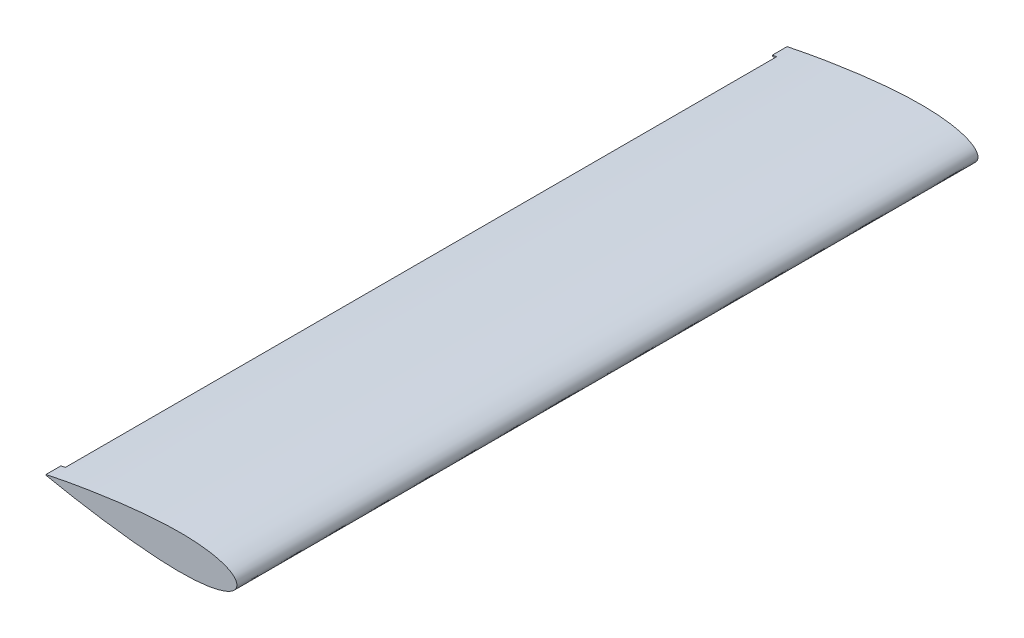
ISO-10303-21;
HEADER;
FILE_DESCRIPTION(('STEP AP214'),'2;1');
FILE_NAME('part.step','',(''),(''),'','','');
FILE_SCHEMA(('AUTOMOTIVE_DESIGN { 1 0 10303 214 1 1 1 1 }'));
ENDSEC;
DATA;
#1=APPLICATION_CONTEXT('core data for automotive mechanical design processes');
#2=APPLICATION_PROTOCOL_DEFINITION('international standard','automotive_design',2000,#1);
#3=PRODUCT_CONTEXT('',#1,'mechanical');
#4=PRODUCT('Part','Part','',(#3));
#5=PRODUCT_RELATED_PRODUCT_CATEGORY('part','',(#4));
#6=PRODUCT_DEFINITION_FORMATION('','',#4);
#7=PRODUCT_DEFINITION_CONTEXT('part definition',#1,'design');
#8=PRODUCT_DEFINITION('design','',#6,#7);
#9=PRODUCT_DEFINITION_SHAPE('','',#8);
#10=(LENGTH_UNIT() NAMED_UNIT(*) SI_UNIT(.MILLI.,.METRE.));
#11=(NAMED_UNIT(*) PLANE_ANGLE_UNIT() SI_UNIT($,.RADIAN.));
#12=(NAMED_UNIT(*) SI_UNIT($,.STERADIAN.) SOLID_ANGLE_UNIT());
#13=UNCERTAINTY_MEASURE_WITH_UNIT(LENGTH_MEASURE(1.E-05),#10,'distance_accuracy_value','');
#14=(GEOMETRIC_REPRESENTATION_CONTEXT(3) GLOBAL_UNCERTAINTY_ASSIGNED_CONTEXT((#13)) GLOBAL_UNIT_ASSIGNED_CONTEXT((#10,
#11,#12)) REPRESENTATION_CONTEXT('',''));
#15=CARTESIAN_POINT('',(0.,0.,0.));
#16=DIRECTION('',(0.,0.,1.));
#17=DIRECTION('',(1.,0.,0.));
#18=AXIS2_PLACEMENT_3D('',#15,#16,#17);
#19=CARTESIAN_POINT('',(-128.823156865199,-0.243601684072974,250.));
#20=DIRECTION('',(1.,9.51385280802963E-12,0.));
#21=DIRECTION('',(-9.51385280802963E-12,1.,0.));
#22=AXIS2_PLACEMENT_3D('',#19,#20,#21);
#23=PLANE('',#22);
#24=DIRECTION('',(-9.51385280802963E-12,1.,0.));
#25=VECTOR('',#24,1.);
#26=CARTESIAN_POINT('',(-128.823156865199,-0.243601684072974,240.));
#27=LINE('',#26,#25);
#28=CARTESIAN_POINT('',(-128.823156865199,-0.243601684072974,240.));
#29=VERTEX_POINT('',#28);
#30=CARTESIAN_POINT('',(-128.823156865204,0.243601683620288,240.));
#31=VERTEX_POINT('',#30);
#32=EDGE_CURVE('E113',#29,#31,#27,.T.);
#33=ORIENTED_EDGE('',*,*,#32,.F.);
#34=DIRECTION('',(0.,0.,-1.));
#35=VECTOR('',#34,1.);
#36=CARTESIAN_POINT('',(-128.823156865199,-0.243601684072974,250.));
#37=LINE('',#36,#35);
#38=CARTESIAN_POINT('',(-128.823156865199,-0.243601684072974,250.));
#39=VERTEX_POINT('',#38);
#40=EDGE_CURVE('E88',#39,#29,#37,.T.);
#41=ORIENTED_EDGE('',*,*,#40,.F.);
#42=DIRECTION('',(9.51385280802963E-12,-1.,0.));
#43=VECTOR('',#42,1.);
#44=CARTESIAN_POINT('',(-128.823156865199,-0.243601684072974,250.));
#45=LINE('',#44,#43);
#46=CARTESIAN_POINT('',(-128.823156865204,0.243601683620288,250.));
#47=VERTEX_POINT('',#46);
#48=EDGE_CURVE('E63',#47,#39,#45,.T.);
#49=ORIENTED_EDGE('',*,*,#48,.F.);
#50=DIRECTION('',(0.,0.,-1.));
#51=VECTOR('',#50,1.);
#52=CARTESIAN_POINT('',(-128.823156865204,0.243601683620288,250.));
#53=LINE('',#52,#51);
#54=EDGE_CURVE('E110',#47,#31,#53,.T.);
#55=ORIENTED_EDGE('',*,*,#54,.T.);
#56=EDGE_LOOP('',(#33,#41,#49,#55));
#57=FACE_BOUND('',#56,.T.);
#58=ADVANCED_FACE('F39',(#57),#23,.F.);
#59=CARTESIAN_POINT('',(-128.823156865199,-0.243601684072974,250.));
#60=CARTESIAN_POINT('',(-126.67714933903,-0.687269090320597,250.));
#61=CARTESIAN_POINT('',(-122.389962266096,-1.57360576228101,250.));
#62=CARTESIAN_POINT('',(-113.807735112211,-3.21807022031134,250.));
#63=CARTESIAN_POINT('',(-103.07949016515,-5.10862701099124,250.));
#64=CARTESIAN_POINT('',(-90.1954893204452,-7.12124715565496,250.));
#65=CARTESIAN_POINT('',(-77.3135815758503,-8.86886751082018,250.));
#66=CARTESIAN_POINT('',(-64.431363132497,-10.2973059157991,250.));
#67=CARTESIAN_POINT('',(-51.5460997412131,-11.3098208599836,250.));
#68=CARTESIAN_POINT('',(-40.7957563190001,-11.669751168641,250.));
#69=CARTESIAN_POINT('',(-32.200591207622,-11.5262309895172,250.));
#70=CARTESIAN_POINT('',(-25.7490073823002,-11.1441462592192,250.));
#71=CARTESIAN_POINT('',(-19.2852859646194,-10.4066141370908,250.));
#72=CARTESIAN_POINT('',(-13.9055558809757,-9.37595496172941,250.));
#73=CARTESIAN_POINT('',(-9.61473988406368,-8.14999777520421,250.));
#74=CARTESIAN_POINT('',(-6.3381794270068,-6.91132829545563,250.));
#75=CARTESIAN_POINT('',(-3.59327506674445,-5.42038826422837,250.));
#76=CARTESIAN_POINT('',(-1.06899642309347,-3.35720252431963,250.));
#77=CARTESIAN_POINT('',(0.697558781943044,1.01585878065042E-09,250.));
#78=CARTESIAN_POINT('',(-1.06899642315786,3.35720252631744,250.));
#79=CARTESIAN_POINT('',(-3.59327506684841,5.42038826617776,250.));
#80=CARTESIAN_POINT('',(-6.33817942713939,6.91132829735238,250.));
#81=CARTESIAN_POINT('',(-9.61473988421998,8.14999777703808,250.));
#82=CARTESIAN_POINT('',(-13.9055558811556,9.37595496348099,250.));
#83=CARTESIAN_POINT('',(-19.285285964819,10.4066141387392,250.));
#84=CARTESIAN_POINT('',(-25.749007382514,11.1441462607436,250.));
#85=CARTESIAN_POINT('',(-32.2005912078431,11.5262309909179,250.));
#86=CARTESIAN_POINT('',(-40.795756319224,11.6697511698768,250.));
#87=CARTESIAN_POINT('',(-51.54609974143,11.3098208610131,250.));
#88=CARTESIAN_POINT('',(-64.4313631326944,10.2973059165815,250.));
#89=CARTESIAN_POINT('',(-77.3135815760204,8.86886751135552,250.));
#90=CARTESIAN_POINT('',(-90.1954893205818,7.12124715594321,250.));
#91=CARTESIAN_POINT('',(-103.079490165248,5.10862701103235,250.));
#92=CARTESIAN_POINT('',(-113.807735112272,3.21807022014666,250.));
#93=CARTESIAN_POINT('',(-122.389962266126,1.57360576195172,250.));
#94=CARTESIAN_POINT('',(-126.677149339043,0.687269089909074,250.));
#95=CARTESIAN_POINT('',(-128.823156865204,0.243601683620288,250.));
#96=B_SPLINE_CURVE_WITH_KNOTS('',3,(#59,#60,#61,#62,#63,#64,#65,#66,#67,#68,#69,#70,#71,#72,#73,
#74,#75,#76,#77,#78,#79,#80,#81,#82,#83,#84,#85,#86,#87,#88,#89,#90,#91,#92,#93,#94,#95),
.UNSPECIFIED.,.F.,.F.,(4,1,1,1,1,1,1,1,1,1,1,1,1,1,1,1,1,1,1,1,1,1,1,1,1,1,1,1,1,1,1,1,1,1,4),
(0.,0.0246038933451094,0.0491524340929429,0.0981085566584546,0.146905125159748,
0.195554766723559,0.244056172228335,0.2924094136053,0.340643604803074,0.364753980610275,
0.388905472973926,0.413177962040512,0.437756077223996,0.45030461507737,0.463229874886268,
0.477067413917468,0.485035659177221,0.5,0.514964340822779,0.522932586082532,0.536770125113732,
0.54969538492263,0.562243922776004,0.586822037959488,0.611094527026074,0.635246019389725,
0.659356395196926,0.7075905863947,0.755943827771665,0.804445233276441,0.853094874840252,
0.901891443341545,0.950847565907057,0.975396106654891,1.),.UNSPECIFIED.);
#97=DIRECTION('',(0.,0.,-1.));
#98=VECTOR('',#97,1.);
#99=SURFACE_OF_LINEAR_EXTRUSION('',#96,#98);
#100=CARTESIAN_POINT('',(-128.823156865204,0.243601683620288,-240.));
#101=VERTEX_POINT('',#100);
#102=CARTESIAN_POINT('',(-128.823156865204,0.243601683620288,-250.));
#103=VERTEX_POINT('',#102);
#104=EDGE_CURVE('E93',#101,#103,#53,.T.);
#105=ORIENTED_EDGE('',*,*,#104,.F.);
#106=CARTESIAN_POINT('',(-128.823156865199,-0.243601684072974,-240.));
#107=CARTESIAN_POINT('',(-126.67714933903,-0.687269090320597,-240.));
#108=CARTESIAN_POINT('',(-122.389962266096,-1.57360576228101,-240.));
#109=CARTESIAN_POINT('',(-113.807735112211,-3.21807022031134,-240.));
#110=CARTESIAN_POINT('',(-103.07949016515,-5.10862701099124,-240.));
#111=CARTESIAN_POINT('',(-90.1954893204452,-7.12124715565496,-240.));
#112=CARTESIAN_POINT('',(-77.3135815758503,-8.86886751082018,-240.));
#113=CARTESIAN_POINT('',(-64.431363132497,-10.2973059157991,-240.));
#114=CARTESIAN_POINT('',(-51.5460997412131,-11.3098208599836,-240.));
#115=CARTESIAN_POINT('',(-40.7957563190001,-11.669751168641,-240.));
#116=CARTESIAN_POINT('',(-32.200591207622,-11.5262309895172,-240.));
#117=CARTESIAN_POINT('',(-25.7490073823002,-11.1441462592192,-240.));
#118=CARTESIAN_POINT('',(-19.2852859646194,-10.4066141370908,-240.));
#119=CARTESIAN_POINT('',(-13.9055558809757,-9.37595496172941,-240.));
#120=CARTESIAN_POINT('',(-9.61473988406368,-8.14999777520421,-240.));
#121=CARTESIAN_POINT('',(-6.3381794270068,-6.91132829545563,-240.));
#122=CARTESIAN_POINT('',(-3.59327506674445,-5.42038826422837,-240.));
#123=CARTESIAN_POINT('',(-1.06899642309347,-3.35720252431963,-240.));
#124=CARTESIAN_POINT('',(0.697558781943044,1.01585878065042E-09,-240.));
#125=CARTESIAN_POINT('',(-1.06899642315786,3.35720252631744,-240.));
#126=CARTESIAN_POINT('',(-3.59327506684841,5.42038826617776,-240.));
#127=CARTESIAN_POINT('',(-6.33817942713939,6.91132829735238,-240.));
#128=CARTESIAN_POINT('',(-9.61473988421998,8.14999777703808,-240.));
#129=CARTESIAN_POINT('',(-13.9055558811556,9.37595496348099,-240.));
#130=CARTESIAN_POINT('',(-19.285285964819,10.4066141387392,-240.));
#131=CARTESIAN_POINT('',(-25.749007382514,11.1441462607436,-240.));
#132=CARTESIAN_POINT('',(-32.2005912078431,11.5262309909179,-240.));
#133=CARTESIAN_POINT('',(-40.795756319224,11.6697511698768,-240.));
#134=CARTESIAN_POINT('',(-51.54609974143,11.3098208610131,-240.));
#135=CARTESIAN_POINT('',(-64.4313631326944,10.2973059165815,-240.));
#136=CARTESIAN_POINT('',(-77.3135815760204,8.86886751135552,-240.));
#137=CARTESIAN_POINT('',(-90.1954893205818,7.12124715594321,-240.));
#138=CARTESIAN_POINT('',(-103.079490165248,5.10862701103235,-240.));
#139=CARTESIAN_POINT('',(-113.807735112272,3.21807022014666,-240.));
#140=CARTESIAN_POINT('',(-122.389962266126,1.57360576195172,-240.));
#141=CARTESIAN_POINT('',(-126.677149339043,0.687269089909074,-240.));
#142=CARTESIAN_POINT('',(-128.823156865204,0.243601683620288,-240.));
#143=B_SPLINE_CURVE_WITH_KNOTS('',3,(#106,#107,#108,#109,#110,#111,#112,#113,#114,#115,#116,
#117,#118,#119,#120,#121,#122,#123,#124,#125,#126,#127,#128,#129,#130,#131,#132,#133,#134,#135,
#136,#137,#138,#139,#140,#141,#142),.UNSPECIFIED.,.F.,.F.,(4,1,1,1,1,1,1,1,1,1,1,1,1,1,1,1,1,1,
1,1,1,1,1,1,1,1,1,1,1,1,1,1,1,1,4),(0.,0.0246038933451094,0.0491524340929429,0.0981085566584546,
0.146905125159748,0.195554766723559,0.244056172228335,0.2924094136053,0.340643604803074,
0.364753980610275,0.388905472973926,0.413177962040512,0.437756077223996,0.45030461507737,
0.463229874886268,0.477067413917468,0.485035659177221,0.5,0.514964340822779,0.522932586082532,
0.536770125113732,0.54969538492263,0.562243922776004,0.586822037959488,0.611094527026074,
0.635246019389725,0.659356395196926,0.7075905863947,0.755943827771665,0.804445233276441,
0.853094874840252,0.901891443341545,0.950847565907057,0.975396106654891,1.),.UNSPECIFIED.);
#144=CARTESIAN_POINT('',(-125.804711972968,0.865958364449682,-240.));
#145=VERTEX_POINT('',#144);
#146=EDGE_CURVE('E98',#101,#145,#143,.F.);
#147=ORIENTED_EDGE('',*,*,#146,.T.);
#148=DIRECTION('',(0.,0.,-1.));
#149=VECTOR('',#148,1.);
#150=CARTESIAN_POINT('',(-125.804711972968,0.86595836821398,250.));
#151=LINE('',#150,#149);
#152=CARTESIAN_POINT('',(-125.804711972968,0.865958364449682,240.));
#153=VERTEX_POINT('',#152);
#154=EDGE_CURVE('E11',#145,#153,#151,.F.);
#155=ORIENTED_EDGE('',*,*,#154,.T.);
#156=CARTESIAN_POINT('',(-128.823156865199,-0.243601684072974,240.));
#157=CARTESIAN_POINT('',(-126.67714933903,-0.687269090320597,240.));
#158=CARTESIAN_POINT('',(-122.389962266096,-1.57360576228101,240.));
#159=CARTESIAN_POINT('',(-113.807735112211,-3.21807022031134,240.));
#160=CARTESIAN_POINT('',(-103.07949016515,-5.10862701099124,240.));
#161=CARTESIAN_POINT('',(-90.1954893204452,-7.12124715565496,240.));
#162=CARTESIAN_POINT('',(-77.3135815758503,-8.86886751082018,240.));
#163=CARTESIAN_POINT('',(-64.431363132497,-10.2973059157991,240.));
#164=CARTESIAN_POINT('',(-51.5460997412131,-11.3098208599836,240.));
#165=CARTESIAN_POINT('',(-40.7957563190001,-11.669751168641,240.));
#166=CARTESIAN_POINT('',(-32.200591207622,-11.5262309895172,240.));
#167=CARTESIAN_POINT('',(-25.7490073823002,-11.1441462592192,240.));
#168=CARTESIAN_POINT('',(-19.2852859646194,-10.4066141370908,240.));
#169=CARTESIAN_POINT('',(-13.9055558809757,-9.37595496172941,240.));
#170=CARTESIAN_POINT('',(-9.61473988406368,-8.14999777520421,240.));
#171=CARTESIAN_POINT('',(-6.3381794270068,-6.91132829545563,240.));
#172=CARTESIAN_POINT('',(-3.59327506674445,-5.42038826422837,240.));
#173=CARTESIAN_POINT('',(-1.06899642309347,-3.35720252431963,240.));
#174=CARTESIAN_POINT('',(0.697558781943044,1.01585878065042E-09,240.));
#175=CARTESIAN_POINT('',(-1.06899642315786,3.35720252631744,240.));
#176=CARTESIAN_POINT('',(-3.59327506684841,5.42038826617776,240.));
#177=CARTESIAN_POINT('',(-6.33817942713939,6.91132829735238,240.));
#178=CARTESIAN_POINT('',(-9.61473988421998,8.14999777703808,240.));
#179=CARTESIAN_POINT('',(-13.9055558811556,9.37595496348099,240.));
#180=CARTESIAN_POINT('',(-19.285285964819,10.4066141387392,240.));
#181=CARTESIAN_POINT('',(-25.749007382514,11.1441462607436,240.));
#182=CARTESIAN_POINT('',(-32.2005912078431,11.5262309909179,240.));
#183=CARTESIAN_POINT('',(-40.795756319224,11.6697511698768,240.));
#184=CARTESIAN_POINT('',(-51.54609974143,11.3098208610131,240.));
#185=CARTESIAN_POINT('',(-64.4313631326944,10.2973059165815,240.));
#186=CARTESIAN_POINT('',(-77.3135815760204,8.86886751135552,240.));
#187=CARTESIAN_POINT('',(-90.1954893205818,7.12124715594321,240.));
#188=CARTESIAN_POINT('',(-103.079490165248,5.10862701103235,240.));
#189=CARTESIAN_POINT('',(-113.807735112272,3.21807022014666,240.));
#190=CARTESIAN_POINT('',(-122.389962266126,1.57360576195172,240.));
#191=CARTESIAN_POINT('',(-126.677149339043,0.687269089909074,240.));
#192=CARTESIAN_POINT('',(-128.823156865204,0.243601683620288,240.));
#193=B_SPLINE_CURVE_WITH_KNOTS('',3,(#156,#157,#158,#159,#160,#161,#162,#163,#164,#165,#166,
#167,#168,#169,#170,#171,#172,#173,#174,#175,#176,#177,#178,#179,#180,#181,#182,#183,#184,#185,
#186,#187,#188,#189,#190,#191,#192),.UNSPECIFIED.,.F.,.F.,(4,1,1,1,1,1,1,1,1,1,1,1,1,1,1,1,1,1,
1,1,1,1,1,1,1,1,1,1,1,1,1,1,1,1,4),(0.,0.0246038933451094,0.0491524340929429,0.0981085566584546,
0.146905125159748,0.195554766723559,0.244056172228335,0.2924094136053,0.340643604803074,
0.364753980610275,0.388905472973926,0.413177962040512,0.437756077223996,0.45030461507737,
0.463229874886268,0.477067413917468,0.485035659177221,0.5,0.514964340822779,0.522932586082532,
0.536770125113732,0.54969538492263,0.562243922776004,0.586822037959488,0.611094527026074,
0.635246019389725,0.659356395196926,0.7075905863947,0.755943827771665,0.804445233276441,
0.853094874840252,0.901891443341545,0.950847565907057,0.975396106654891,1.),.UNSPECIFIED.);
#194=EDGE_CURVE('E135',#31,#153,#193,.F.);
#195=ORIENTED_EDGE('',*,*,#194,.F.);
#196=ORIENTED_EDGE('',*,*,#54,.F.);
#197=EDGE_CURVE('E95',#39,#47,#96,.T.);
#198=ORIENTED_EDGE('',*,*,#197,.F.);
#199=ORIENTED_EDGE('',*,*,#40,.T.);
#200=CARTESIAN_POINT('',(-125.804711972968,-0.865958364841068,240.));
#201=VERTEX_POINT('',#200);
#202=EDGE_CURVE('E55',#201,#29,#193,.F.);
#203=ORIENTED_EDGE('',*,*,#202,.F.);
#204=DIRECTION('',(0.,0.,-1.));
#205=VECTOR('',#204,1.);
#206=CARTESIAN_POINT('',(-125.804711972968,-0.86595836860536,250.));
#207=LINE('',#206,#205);
#208=CARTESIAN_POINT('',(-125.804711972968,-0.865958364841068,-240.));
#209=VERTEX_POINT('',#208);
#210=EDGE_CURVE('E48',#201,#209,#207,.T.);
#211=ORIENTED_EDGE('',*,*,#210,.T.);
#212=CARTESIAN_POINT('',(-128.823156865199,-0.243601684072974,-240.));
#213=VERTEX_POINT('',#212);
#214=EDGE_CURVE('E85',#209,#213,#143,.F.);
#215=ORIENTED_EDGE('',*,*,#214,.T.);
#216=CARTESIAN_POINT('',(-128.823156865199,-0.243601684072974,-250.));
#217=VERTEX_POINT('',#216);
#218=EDGE_CURVE('E77',#213,#217,#37,.T.);
#219=ORIENTED_EDGE('',*,*,#218,.T.);
#220=CARTESIAN_POINT('',(-128.823156865199,-0.243601684072974,-250.));
#221=CARTESIAN_POINT('',(-126.67714933903,-0.687269090320597,-250.));
#222=CARTESIAN_POINT('',(-122.389962266096,-1.57360576228101,-250.));
#223=CARTESIAN_POINT('',(-113.807735112211,-3.21807022031134,-250.));
#224=CARTESIAN_POINT('',(-103.07949016515,-5.10862701099124,-250.));
#225=CARTESIAN_POINT('',(-90.1954893204452,-7.12124715565496,-250.));
#226=CARTESIAN_POINT('',(-77.3135815758503,-8.86886751082018,-250.));
#227=CARTESIAN_POINT('',(-64.431363132497,-10.2973059157991,-250.));
#228=CARTESIAN_POINT('',(-51.5460997412131,-11.3098208599836,-250.));
#229=CARTESIAN_POINT('',(-40.7957563190001,-11.669751168641,-250.));
#230=CARTESIAN_POINT('',(-32.200591207622,-11.5262309895172,-250.));
#231=CARTESIAN_POINT('',(-25.7490073823002,-11.1441462592192,-250.));
#232=CARTESIAN_POINT('',(-19.2852859646194,-10.4066141370908,-250.));
#233=CARTESIAN_POINT('',(-13.9055558809757,-9.37595496172941,-250.));
#234=CARTESIAN_POINT('',(-9.61473988406368,-8.14999777520421,-250.));
#235=CARTESIAN_POINT('',(-6.3381794270068,-6.91132829545563,-250.));
#236=CARTESIAN_POINT('',(-3.59327506674445,-5.42038826422837,-250.));
#237=CARTESIAN_POINT('',(-1.06899642309347,-3.35720252431963,-250.));
#238=CARTESIAN_POINT('',(0.697558781943044,1.01585878065042E-09,-250.));
#239=CARTESIAN_POINT('',(-1.06899642315786,3.35720252631744,-250.));
#240=CARTESIAN_POINT('',(-3.59327506684841,5.42038826617776,-250.));
#241=CARTESIAN_POINT('',(-6.33817942713939,6.91132829735238,-250.));
#242=CARTESIAN_POINT('',(-9.61473988421998,8.14999777703808,-250.));
#243=CARTESIAN_POINT('',(-13.9055558811556,9.37595496348099,-250.));
#244=CARTESIAN_POINT('',(-19.285285964819,10.4066141387392,-250.));
#245=CARTESIAN_POINT('',(-25.749007382514,11.1441462607436,-250.));
#246=CARTESIAN_POINT('',(-32.2005912078431,11.5262309909179,-250.));
#247=CARTESIAN_POINT('',(-40.795756319224,11.6697511698768,-250.));
#248=CARTESIAN_POINT('',(-51.54609974143,11.3098208610131,-250.));
#249=CARTESIAN_POINT('',(-64.4313631326944,10.2973059165815,-250.));
#250=CARTESIAN_POINT('',(-77.3135815760204,8.86886751135552,-250.));
#251=CARTESIAN_POINT('',(-90.1954893205818,7.12124715594321,-250.));
#252=CARTESIAN_POINT('',(-103.079490165248,5.10862701103235,-250.));
#253=CARTESIAN_POINT('',(-113.807735112272,3.21807022014666,-250.));
#254=CARTESIAN_POINT('',(-122.389962266126,1.57360576195172,-250.));
#255=CARTESIAN_POINT('',(-126.677149339043,0.687269089909074,-250.));
#256=CARTESIAN_POINT('',(-128.823156865204,0.243601683620288,-250.));
#257=B_SPLINE_CURVE_WITH_KNOTS('',3,(#220,#221,#222,#223,#224,#225,#226,#227,#228,#229,#230,
#231,#232,#233,#234,#235,#236,#237,#238,#239,#240,#241,#242,#243,#244,#245,#246,#247,#248,#249,
#250,#251,#252,#253,#254,#255,#256),.UNSPECIFIED.,.F.,.F.,(4,1,1,1,1,1,1,1,1,1,1,1,1,1,1,1,1,1,
1,1,1,1,1,1,1,1,1,1,1,1,1,1,1,1,4),(0.,0.0246038933451094,0.0491524340929429,0.0981085566584546,
0.146905125159748,0.195554766723559,0.244056172228335,0.2924094136053,0.340643604803074,
0.364753980610275,0.388905472973926,0.413177962040512,0.437756077223996,0.45030461507737,
0.463229874886268,0.477067413917468,0.485035659177221,0.5,0.514964340822779,0.522932586082532,
0.536770125113732,0.54969538492263,0.562243922776004,0.586822037959488,0.611094527026074,
0.635246019389725,0.659356395196926,0.7075905863947,0.755943827771665,0.804445233276441,
0.853094874840252,0.901891443341545,0.950847565907057,0.975396106654891,1.),.UNSPECIFIED.);
#258=EDGE_CURVE('E81',#217,#103,#257,.T.);
#259=ORIENTED_EDGE('',*,*,#258,.T.);
#260=EDGE_LOOP('',(#105,#147,#155,#195,#196,#198,#199,#203,#211,#215,#219,#259));
#261=FACE_BOUND('',#260,.T.);
#262=ADVANCED_FACE('F41',(#261),#99,.F.);
#263=ORIENTED_EDGE('',*,*,#218,.F.);
#264=DIRECTION('',(-9.51385280802963E-12,1.,0.));
#265=VECTOR('',#264,1.);
#266=CARTESIAN_POINT('',(-128.823156865199,-0.243601684072974,-240.));
#267=LINE('',#266,#265);
#268=EDGE_CURVE('E115',#213,#101,#267,.T.);
#269=ORIENTED_EDGE('',*,*,#268,.T.);
#270=ORIENTED_EDGE('',*,*,#104,.T.);
#271=DIRECTION('',(9.51385280802963E-12,-1.,0.));
#272=VECTOR('',#271,1.);
#273=CARTESIAN_POINT('',(-128.823156865199,-0.243601684072974,-250.));
#274=LINE('',#273,#272);
#275=EDGE_CURVE('E91',#103,#217,#274,.T.);
#276=ORIENTED_EDGE('',*,*,#275,.T.);
#277=EDGE_LOOP('',(#263,#269,#270,#276));
#278=FACE_BOUND('',#277,.T.);
#279=ADVANCED_FACE('F92',(#278),#23,.F.);
#280=CARTESIAN_POINT('',(1.45249480845711E-11,1.00915933595735E-09,250.));
#281=DIRECTION('',(0.,0.,1.));
#282=DIRECTION('',(1.,0.,0.));
#283=AXIS2_PLACEMENT_3D('',#280,#281,#282);
#284=PLANE('',#283);
#285=ORIENTED_EDGE('',*,*,#197,.T.);
#286=ORIENTED_EDGE('',*,*,#48,.T.);
#287=EDGE_LOOP('',(#285,#286));
#288=FACE_BOUND('',#287,.T.);
#289=ADVANCED_FACE('F157',(#288),#284,.T.);
#290=CARTESIAN_POINT('',(1.45249480845711E-11,1.00915933595735E-09,-250.));
#291=DIRECTION('',(0.,0.,1.));
#292=DIRECTION('',(1.,0.,0.));
#293=AXIS2_PLACEMENT_3D('',#290,#291,#292);
#294=PLANE('',#293);
#295=ORIENTED_EDGE('',*,*,#258,.F.);
#296=ORIENTED_EDGE('',*,*,#275,.F.);
#297=EDGE_LOOP('',(#295,#296));
#298=FACE_BOUND('',#297,.T.);
#299=ADVANCED_FACE('F97',(#298),#294,.F.);
#300=CARTESIAN_POINT('',(-125.804711972968,-1.25,-240.));
#301=DIRECTION('',(1.,0.,0.));
#302=DIRECTION('',(0.,0.,-1.));
#303=AXIS2_PLACEMENT_3D('',#300,#301,#302);
#304=PLANE('',#303);
#305=DIRECTION('',(0.,1.,0.));
#306=VECTOR('',#305,1.);
#307=CARTESIAN_POINT('',(-125.804711972968,-1.25,240.));
#308=LINE('',#307,#306);
#309=EDGE_CURVE('E128',#201,#153,#308,.T.);
#310=ORIENTED_EDGE('',*,*,#309,.T.);
#311=ORIENTED_EDGE('',*,*,#154,.F.);
#312=DIRECTION('',(0.,1.,0.));
#313=VECTOR('',#312,1.);
#314=CARTESIAN_POINT('',(-125.804711972968,-1.25,-240.));
#315=LINE('',#314,#313);
#316=EDGE_CURVE('E130',#209,#145,#315,.T.);
#317=ORIENTED_EDGE('',*,*,#316,.F.);
#318=ORIENTED_EDGE('',*,*,#210,.F.);
#319=EDGE_LOOP('',(#310,#311,#317,#318));
#320=FACE_BOUND('',#319,.T.);
#321=ADVANCED_FACE('F125',(#320),#304,.F.);
#322=CARTESIAN_POINT('',(0.,0.,-240.));
#323=DIRECTION('',(0.,0.,-1.));
#324=DIRECTION('',(-1.,0.,0.));
#325=AXIS2_PLACEMENT_3D('',#322,#323,#324);
#326=PLANE('',#325);
#327=ORIENTED_EDGE('',*,*,#268,.F.);
#328=ORIENTED_EDGE('',*,*,#214,.F.);
#329=ORIENTED_EDGE('',*,*,#316,.T.);
#330=ORIENTED_EDGE('',*,*,#146,.F.);
#331=EDGE_LOOP('',(#327,#328,#329,#330));
#332=FACE_BOUND('',#331,.T.);
#333=ADVANCED_FACE('F166',(#332),#326,.F.);
#334=CARTESIAN_POINT('',(0.,0.,240.));
#335=DIRECTION('',(0.,0.,-1.));
#336=DIRECTION('',(-1.,0.,0.));
#337=AXIS2_PLACEMENT_3D('',#334,#335,#336);
#338=PLANE('',#337);
#339=ORIENTED_EDGE('',*,*,#194,.T.);
#340=ORIENTED_EDGE('',*,*,#309,.F.);
#341=ORIENTED_EDGE('',*,*,#202,.T.);
#342=ORIENTED_EDGE('',*,*,#32,.T.);
#343=EDGE_LOOP('',(#339,#340,#341,#342));
#344=FACE_BOUND('',#343,.T.);
#345=ADVANCED_FACE('F133',(#344),#338,.T.);
#346=CLOSED_SHELL('',(#58,#262,#279,#289,#299,#321,#333,#345));
#347=MANIFOLD_SOLID_BREP('B2',#346);
#348=ADVANCED_BREP_SHAPE_REPRESENTATION('',(#18,#347),#14);
#349=SHAPE_DEFINITION_REPRESENTATION(#9,#348);
ENDSEC;
END-ISO-10303-21;
